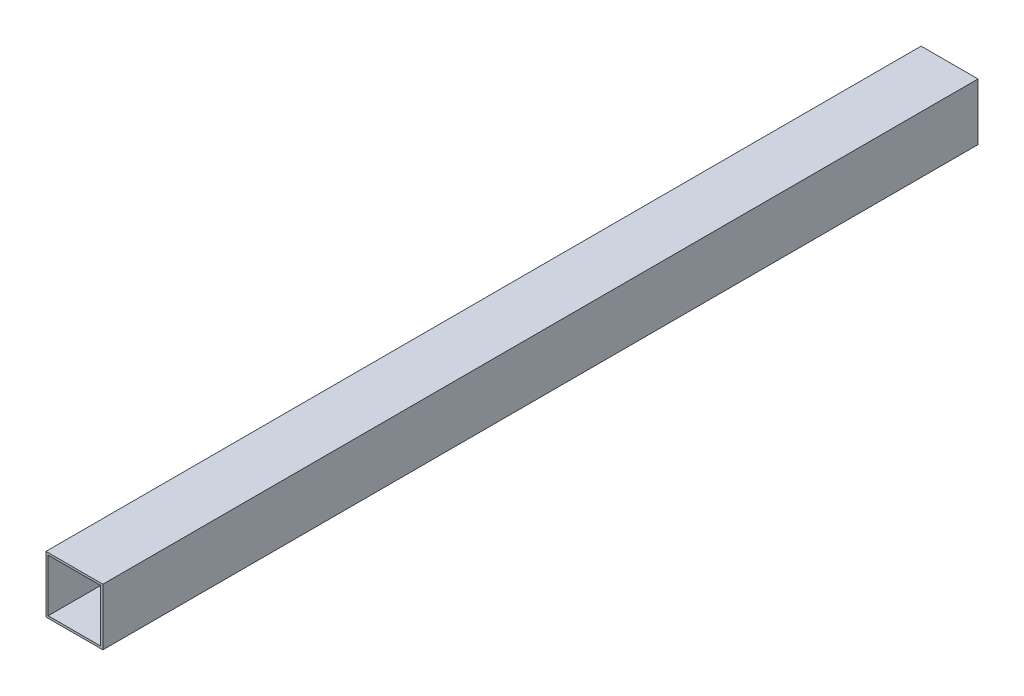
ISO-10303-21;
HEADER;
FILE_DESCRIPTION(('STEP AP214'),'2;1');
FILE_NAME('part.step','',(''),(''),'','','');
FILE_SCHEMA(('AUTOMOTIVE_DESIGN { 1 0 10303 214 1 1 1 1 }'));
ENDSEC;
DATA;
#1=APPLICATION_CONTEXT('core data for automotive mechanical design processes');
#2=APPLICATION_PROTOCOL_DEFINITION('international standard','automotive_design',2000,#1);
#3=PRODUCT_CONTEXT('',#1,'mechanical');
#4=PRODUCT('Part','Part','',(#3));
#5=PRODUCT_RELATED_PRODUCT_CATEGORY('part','',(#4));
#6=PRODUCT_DEFINITION_FORMATION('','',#4);
#7=PRODUCT_DEFINITION_CONTEXT('part definition',#1,'design');
#8=PRODUCT_DEFINITION('design','',#6,#7);
#9=PRODUCT_DEFINITION_SHAPE('','',#8);
#10=(LENGTH_UNIT() NAMED_UNIT(*) SI_UNIT(.MILLI.,.METRE.));
#11=(NAMED_UNIT(*) PLANE_ANGLE_UNIT() SI_UNIT($,.RADIAN.));
#12=(NAMED_UNIT(*) SI_UNIT($,.STERADIAN.) SOLID_ANGLE_UNIT());
#13=UNCERTAINTY_MEASURE_WITH_UNIT(LENGTH_MEASURE(1.E-05),#10,'distance_accuracy_value','');
#14=(GEOMETRIC_REPRESENTATION_CONTEXT(3) GLOBAL_UNCERTAINTY_ASSIGNED_CONTEXT((#13)) GLOBAL_UNIT_ASSIGNED_CONTEXT((#10,
#11,#12)) REPRESENTATION_CONTEXT('',''));
#15=CARTESIAN_POINT('',(0.,0.,0.));
#16=DIRECTION('',(0.,0.,1.));
#17=DIRECTION('',(1.,0.,0.));
#18=AXIS2_PLACEMENT_3D('',#15,#16,#17);
#19=CARTESIAN_POINT('',(0.,0.,200.));
#20=DIRECTION('',(0.,0.,1.));
#21=DIRECTION('',(1.,0.,0.));
#22=AXIS2_PLACEMENT_3D('',#19,#20,#21);
#23=PLANE('',#22);
#24=DIRECTION('',(0.,1.,0.));
#25=VECTOR('',#24,1.);
#26=CARTESIAN_POINT('',(6.5,6.5,200.));
#27=LINE('',#26,#25);
#28=CARTESIAN_POINT('',(6.5,-6.5,200.));
#29=VERTEX_POINT('',#28);
#30=CARTESIAN_POINT('',(6.5,6.5,200.));
#31=VERTEX_POINT('',#30);
#32=EDGE_CURVE('E134',#29,#31,#27,.T.);
#33=ORIENTED_EDGE('',*,*,#32,.T.);
#34=DIRECTION('',(-1.,0.,0.));
#35=VECTOR('',#34,1.);
#36=CARTESIAN_POINT('',(-6.5,6.5,200.));
#37=LINE('',#36,#35);
#38=CARTESIAN_POINT('',(-6.5,6.5,200.));
#39=VERTEX_POINT('',#38);
#40=EDGE_CURVE('E137',#31,#39,#37,.T.);
#41=ORIENTED_EDGE('',*,*,#40,.T.);
#42=DIRECTION('',(0.,-1.,0.));
#43=VECTOR('',#42,1.);
#44=CARTESIAN_POINT('',(-6.5,6.5,200.));
#45=LINE('',#44,#43);
#46=CARTESIAN_POINT('',(-6.5,-6.5,200.));
#47=VERTEX_POINT('',#46);
#48=EDGE_CURVE('E140',#39,#47,#45,.T.);
#49=ORIENTED_EDGE('',*,*,#48,.T.);
#50=DIRECTION('',(1.,0.,0.));
#51=VECTOR('',#50,1.);
#52=CARTESIAN_POINT('',(-6.5,-6.5,200.));
#53=LINE('',#52,#51);
#54=EDGE_CURVE('E142',#47,#29,#53,.T.);
#55=ORIENTED_EDGE('',*,*,#54,.T.);
#56=EDGE_LOOP('',(#33,#41,#49,#55));
#57=FACE_BOUND('',#56,.T.);
#58=DIRECTION('',(1.,0.,0.));
#59=VECTOR('',#58,1.);
#60=CARTESIAN_POINT('',(6.,-6.,200.));
#61=LINE('',#60,#59);
#62=CARTESIAN_POINT('',(-6.,-6.,200.));
#63=VERTEX_POINT('',#62);
#64=CARTESIAN_POINT('',(6.,-6.,200.));
#65=VERTEX_POINT('',#64);
#66=EDGE_CURVE('E106',#63,#65,#61,.T.);
#67=ORIENTED_EDGE('',*,*,#66,.F.);
#68=DIRECTION('',(0.,-1.,0.));
#69=VECTOR('',#68,1.);
#70=CARTESIAN_POINT('',(-6.,6.,200.));
#71=LINE('',#70,#69);
#72=CARTESIAN_POINT('',(-6.,6.,200.));
#73=VERTEX_POINT('',#72);
#74=EDGE_CURVE('E98',#73,#63,#71,.T.);
#75=ORIENTED_EDGE('',*,*,#74,.F.);
#76=DIRECTION('',(-1.,0.,0.));
#77=VECTOR('',#76,1.);
#78=CARTESIAN_POINT('',(6.,6.,200.));
#79=LINE('',#78,#77);
#80=CARTESIAN_POINT('',(6.,6.,200.));
#81=VERTEX_POINT('',#80);
#82=EDGE_CURVE('E120',#81,#73,#79,.T.);
#83=ORIENTED_EDGE('',*,*,#82,.F.);
#84=DIRECTION('',(0.,1.,0.));
#85=VECTOR('',#84,1.);
#86=CARTESIAN_POINT('',(6.,6.,200.));
#87=LINE('',#86,#85);
#88=EDGE_CURVE('E118',#65,#81,#87,.T.);
#89=ORIENTED_EDGE('',*,*,#88,.F.);
#90=EDGE_LOOP('',(#67,#75,#83,#89));
#91=FACE_BOUND('',#90,.T.);
#92=ADVANCED_FACE('F33',(#57,#91),#23,.T.);
#93=CARTESIAN_POINT('',(0.,0.,0.));
#94=DIRECTION('',(0.,0.,1.));
#95=DIRECTION('',(1.,0.,0.));
#96=AXIS2_PLACEMENT_3D('',#93,#94,#95);
#97=PLANE('',#96);
#98=DIRECTION('',(0.,1.,0.));
#99=VECTOR('',#98,1.);
#100=CARTESIAN_POINT('',(6.5,6.5,0.));
#101=LINE('',#100,#99);
#102=CARTESIAN_POINT('',(6.5,-6.5,0.));
#103=VERTEX_POINT('',#102);
#104=CARTESIAN_POINT('',(6.5,6.5,0.));
#105=VERTEX_POINT('',#104);
#106=EDGE_CURVE('E114',#103,#105,#101,.T.);
#107=ORIENTED_EDGE('',*,*,#106,.F.);
#108=DIRECTION('',(1.,0.,0.));
#109=VECTOR('',#108,1.);
#110=CARTESIAN_POINT('',(-6.5,-6.5,0.));
#111=LINE('',#110,#109);
#112=CARTESIAN_POINT('',(-6.5,-6.5,0.));
#113=VERTEX_POINT('',#112);
#114=EDGE_CURVE('E138',#113,#103,#111,.T.);
#115=ORIENTED_EDGE('',*,*,#114,.F.);
#116=DIRECTION('',(0.,-1.,0.));
#117=VECTOR('',#116,1.);
#118=CARTESIAN_POINT('',(-6.5,6.5,0.));
#119=LINE('',#118,#117);
#120=CARTESIAN_POINT('',(-6.5,6.5,0.));
#121=VERTEX_POINT('',#120);
#122=EDGE_CURVE('E149',#121,#113,#119,.T.);
#123=ORIENTED_EDGE('',*,*,#122,.F.);
#124=DIRECTION('',(-1.,0.,0.));
#125=VECTOR('',#124,1.);
#126=CARTESIAN_POINT('',(-6.5,6.5,0.));
#127=LINE('',#126,#125);
#128=EDGE_CURVE('E147',#105,#121,#127,.T.);
#129=ORIENTED_EDGE('',*,*,#128,.F.);
#130=EDGE_LOOP('',(#107,#115,#123,#129));
#131=FACE_BOUND('',#130,.T.);
#132=DIRECTION('',(0.,-1.,0.));
#133=VECTOR('',#132,1.);
#134=CARTESIAN_POINT('',(-6.,6.,0.));
#135=LINE('',#134,#133);
#136=CARTESIAN_POINT('',(-6.,6.,0.));
#137=VERTEX_POINT('',#136);
#138=CARTESIAN_POINT('',(-6.,-6.,0.));
#139=VERTEX_POINT('',#138);
#140=EDGE_CURVE('E56',#137,#139,#135,.T.);
#141=ORIENTED_EDGE('',*,*,#140,.T.);
#142=DIRECTION('',(1.,0.,0.));
#143=VECTOR('',#142,1.);
#144=CARTESIAN_POINT('',(6.,-6.,0.));
#145=LINE('',#144,#143);
#146=CARTESIAN_POINT('',(6.,-6.,0.));
#147=VERTEX_POINT('',#146);
#148=EDGE_CURVE('E113',#139,#147,#145,.T.);
#149=ORIENTED_EDGE('',*,*,#148,.T.);
#150=DIRECTION('',(0.,1.,0.));
#151=VECTOR('',#150,1.);
#152=CARTESIAN_POINT('',(6.,6.,0.));
#153=LINE('',#152,#151);
#154=CARTESIAN_POINT('',(6.,6.,0.));
#155=VERTEX_POINT('',#154);
#156=EDGE_CURVE('E126',#147,#155,#153,.T.);
#157=ORIENTED_EDGE('',*,*,#156,.T.);
#158=DIRECTION('',(-1.,0.,0.));
#159=VECTOR('',#158,1.);
#160=CARTESIAN_POINT('',(6.,6.,0.));
#161=LINE('',#160,#159);
#162=EDGE_CURVE('E107',#155,#137,#161,.T.);
#163=ORIENTED_EDGE('',*,*,#162,.T.);
#164=EDGE_LOOP('',(#141,#149,#157,#163));
#165=FACE_BOUND('',#164,.T.);
#166=ADVANCED_FACE('F167',(#131,#165),#97,.F.);
#167=CARTESIAN_POINT('',(6.5,6.5,200.));
#168=DIRECTION('',(-1.,0.,0.));
#169=DIRECTION('',(0.,0.,1.));
#170=AXIS2_PLACEMENT_3D('',#167,#168,#169);
#171=PLANE('',#170);
#172=ORIENTED_EDGE('',*,*,#106,.T.);
#173=DIRECTION('',(0.,0.,-1.));
#174=VECTOR('',#173,1.);
#175=CARTESIAN_POINT('',(6.5,6.5,200.));
#176=LINE('',#175,#174);
#177=EDGE_CURVE('E11',#31,#105,#176,.T.);
#178=ORIENTED_EDGE('',*,*,#177,.F.);
#179=ORIENTED_EDGE('',*,*,#32,.F.);
#180=DIRECTION('',(0.,0.,-1.));
#181=VECTOR('',#180,1.);
#182=CARTESIAN_POINT('',(6.5,-6.5,200.));
#183=LINE('',#182,#181);
#184=EDGE_CURVE('E144',#29,#103,#183,.T.);
#185=ORIENTED_EDGE('',*,*,#184,.T.);
#186=EDGE_LOOP('',(#172,#178,#179,#185));
#187=FACE_BOUND('',#186,.T.);
#188=ADVANCED_FACE('F35',(#187),#171,.F.);
#189=CARTESIAN_POINT('',(-6.5,6.5,200.));
#190=DIRECTION('',(0.,-1.,0.));
#191=DIRECTION('',(0.,0.,-1.));
#192=AXIS2_PLACEMENT_3D('',#189,#190,#191);
#193=PLANE('',#192);
#194=ORIENTED_EDGE('',*,*,#128,.T.);
#195=DIRECTION('',(0.,0.,-1.));
#196=VECTOR('',#195,1.);
#197=CARTESIAN_POINT('',(-6.5,6.5,200.));
#198=LINE('',#197,#196);
#199=EDGE_CURVE('E41',#39,#121,#198,.T.);
#200=ORIENTED_EDGE('',*,*,#199,.F.);
#201=ORIENTED_EDGE('',*,*,#40,.F.);
#202=ORIENTED_EDGE('',*,*,#177,.T.);
#203=EDGE_LOOP('',(#194,#200,#201,#202));
#204=FACE_BOUND('',#203,.T.);
#205=ADVANCED_FACE('F177',(#204),#193,.F.);
#206=CARTESIAN_POINT('',(-6.5,6.5,200.));
#207=DIRECTION('',(1.,0.,0.));
#208=DIRECTION('',(0.,1.,0.));
#209=AXIS2_PLACEMENT_3D('',#206,#207,#208);
#210=PLANE('',#209);
#211=ORIENTED_EDGE('',*,*,#122,.T.);
#212=DIRECTION('',(0.,0.,-1.));
#213=VECTOR('',#212,1.);
#214=CARTESIAN_POINT('',(-6.5,-6.5,200.));
#215=LINE('',#214,#213);
#216=EDGE_CURVE('E154',#47,#113,#215,.T.);
#217=ORIENTED_EDGE('',*,*,#216,.F.);
#218=ORIENTED_EDGE('',*,*,#48,.F.);
#219=ORIENTED_EDGE('',*,*,#199,.T.);
#220=EDGE_LOOP('',(#211,#217,#218,#219));
#221=FACE_BOUND('',#220,.T.);
#222=ADVANCED_FACE('F161',(#221),#210,.F.);
#223=CARTESIAN_POINT('',(-6.5,-6.5,200.));
#224=DIRECTION('',(0.,1.,0.));
#225=DIRECTION('',(0.,0.,1.));
#226=AXIS2_PLACEMENT_3D('',#223,#224,#225);
#227=PLANE('',#226);
#228=ORIENTED_EDGE('',*,*,#114,.T.);
#229=ORIENTED_EDGE('',*,*,#184,.F.);
#230=ORIENTED_EDGE('',*,*,#54,.F.);
#231=ORIENTED_EDGE('',*,*,#216,.T.);
#232=EDGE_LOOP('',(#228,#229,#230,#231));
#233=FACE_BOUND('',#232,.T.);
#234=ADVANCED_FACE('F171',(#233),#227,.F.);
#235=CARTESIAN_POINT('',(-6.,6.,200.));
#236=DIRECTION('',(1.,0.,0.));
#237=DIRECTION('',(0.,1.,0.));
#238=AXIS2_PLACEMENT_3D('',#235,#236,#237);
#239=PLANE('',#238);
#240=ORIENTED_EDGE('',*,*,#140,.F.);
#241=DIRECTION('',(0.,0.,-1.));
#242=VECTOR('',#241,1.);
#243=CARTESIAN_POINT('',(-6.,6.,200.));
#244=LINE('',#243,#242);
#245=EDGE_CURVE('E102',#73,#137,#244,.T.);
#246=ORIENTED_EDGE('',*,*,#245,.F.);
#247=ORIENTED_EDGE('',*,*,#74,.T.);
#248=DIRECTION('',(0.,0.,-1.));
#249=VECTOR('',#248,1.);
#250=CARTESIAN_POINT('',(-6.,-6.,200.));
#251=LINE('',#250,#249);
#252=EDGE_CURVE('E101',#63,#139,#251,.T.);
#253=ORIENTED_EDGE('',*,*,#252,.T.);
#254=EDGE_LOOP('',(#240,#246,#247,#253));
#255=FACE_BOUND('',#254,.T.);
#256=ADVANCED_FACE('F100',(#255),#239,.T.);
#257=CARTESIAN_POINT('',(6.,-6.,200.));
#258=DIRECTION('',(0.,1.,0.));
#259=DIRECTION('',(-1.,0.,0.));
#260=AXIS2_PLACEMENT_3D('',#257,#258,#259);
#261=PLANE('',#260);
#262=ORIENTED_EDGE('',*,*,#148,.F.);
#263=ORIENTED_EDGE('',*,*,#252,.F.);
#264=ORIENTED_EDGE('',*,*,#66,.T.);
#265=DIRECTION('',(0.,0.,-1.));
#266=VECTOR('',#265,1.);
#267=CARTESIAN_POINT('',(6.,-6.,200.));
#268=LINE('',#267,#266);
#269=EDGE_CURVE('E115',#65,#147,#268,.T.);
#270=ORIENTED_EDGE('',*,*,#269,.T.);
#271=EDGE_LOOP('',(#262,#263,#264,#270));
#272=FACE_BOUND('',#271,.T.);
#273=ADVANCED_FACE('F110',(#272),#261,.T.);
#274=CARTESIAN_POINT('',(6.,6.,200.));
#275=DIRECTION('',(-1.,0.,0.));
#276=DIRECTION('',(0.,-1.,0.));
#277=AXIS2_PLACEMENT_3D('',#274,#275,#276);
#278=PLANE('',#277);
#279=ORIENTED_EDGE('',*,*,#156,.F.);
#280=ORIENTED_EDGE('',*,*,#269,.F.);
#281=ORIENTED_EDGE('',*,*,#88,.T.);
#282=DIRECTION('',(0.,0.,-1.));
#283=VECTOR('',#282,1.);
#284=CARTESIAN_POINT('',(6.,6.,200.));
#285=LINE('',#284,#283);
#286=EDGE_CURVE('E48',#81,#155,#285,.T.);
#287=ORIENTED_EDGE('',*,*,#286,.T.);
#288=EDGE_LOOP('',(#279,#280,#281,#287));
#289=FACE_BOUND('',#288,.T.);
#290=ADVANCED_FACE('F200',(#289),#278,.T.);
#291=CARTESIAN_POINT('',(6.,6.,200.));
#292=DIRECTION('',(0.,-1.,0.));
#293=DIRECTION('',(1.,0.,0.));
#294=AXIS2_PLACEMENT_3D('',#291,#292,#293);
#295=PLANE('',#294);
#296=ORIENTED_EDGE('',*,*,#162,.F.);
#297=ORIENTED_EDGE('',*,*,#286,.F.);
#298=ORIENTED_EDGE('',*,*,#82,.T.);
#299=ORIENTED_EDGE('',*,*,#245,.T.);
#300=EDGE_LOOP('',(#296,#297,#298,#299));
#301=FACE_BOUND('',#300,.T.);
#302=ADVANCED_FACE('F204',(#301),#295,.T.);
#303=CLOSED_SHELL('',(#92,#166,#188,#205,#222,#234,#256,#273,#290,#302));
#304=MANIFOLD_SOLID_BREP('B2',#303);
#305=ADVANCED_BREP_SHAPE_REPRESENTATION('',(#18,#304),#14);
#306=SHAPE_DEFINITION_REPRESENTATION(#9,#305);
ENDSEC;
END-ISO-10303-21;
